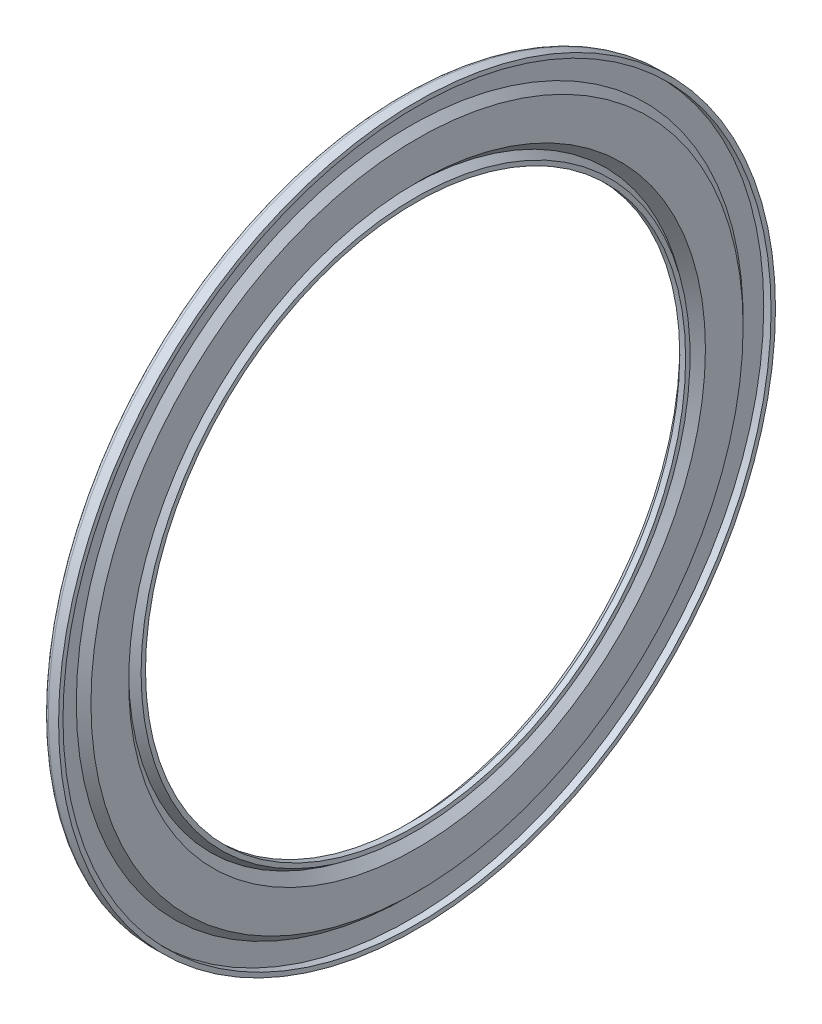
ISO-10303-21;
HEADER;
FILE_DESCRIPTION(('STEP AP214'),'2;1');
FILE_NAME('part.step','',(''),(''),'','','');
FILE_SCHEMA(('AUTOMOTIVE_DESIGN { 1 0 10303 214 1 1 1 1 }'));
ENDSEC;
DATA;
#1=APPLICATION_CONTEXT('core data for automotive mechanical design processes');
#2=APPLICATION_PROTOCOL_DEFINITION('international standard','automotive_design',2000,#1);
#3=PRODUCT_CONTEXT('',#1,'mechanical');
#4=PRODUCT('Part','Part','',(#3));
#5=PRODUCT_RELATED_PRODUCT_CATEGORY('part','',(#4));
#6=PRODUCT_DEFINITION_FORMATION('','',#4);
#7=PRODUCT_DEFINITION_CONTEXT('part definition',#1,'design');
#8=PRODUCT_DEFINITION('design','',#6,#7);
#9=PRODUCT_DEFINITION_SHAPE('','',#8);
#10=(LENGTH_UNIT() NAMED_UNIT(*) SI_UNIT(.MILLI.,.METRE.));
#11=(NAMED_UNIT(*) PLANE_ANGLE_UNIT() SI_UNIT($,.RADIAN.));
#12=(NAMED_UNIT(*) SI_UNIT($,.STERADIAN.) SOLID_ANGLE_UNIT());
#13=UNCERTAINTY_MEASURE_WITH_UNIT(LENGTH_MEASURE(1.E-05),#10,'distance_accuracy_value','');
#14=(GEOMETRIC_REPRESENTATION_CONTEXT(3) GLOBAL_UNCERTAINTY_ASSIGNED_CONTEXT((#13)) GLOBAL_UNIT_ASSIGNED_CONTEXT((#10,
#11,#12)) REPRESENTATION_CONTEXT('',''));
#15=CARTESIAN_POINT('',(0.,0.,0.));
#16=DIRECTION('',(0.,0.,1.));
#17=DIRECTION('',(1.,0.,0.));
#18=AXIS2_PLACEMENT_3D('',#15,#16,#17);
#19=CARTESIAN_POINT('',(9.7525,0.,35.703125));
#20=DIRECTION('',(-1.,0.,0.));
#21=DIRECTION('',(0.,0.,1.));
#22=AXIS2_PLACEMENT_3D('',#19,#20,#21);
#23=PLANE('',#22);
#24=CARTESIAN_POINT('',(9.75249999999999,0.,0.));
#25=DIRECTION('',(1.,0.,0.));
#26=DIRECTION('',(0.,0.,-1.));
#27=AXIS2_PLACEMENT_3D('',#24,#25,#26);
#28=CIRCLE('',#27,33.63925);
#29=CARTESIAN_POINT('',(9.75249999999999,0.,-33.63925));
#30=VERTEX_POINT('',#29);
#31=EDGE_CURVE('E63',#30,#30,#28,.F.);
#32=ORIENTED_EDGE('',*,*,#31,.F.);
#33=EDGE_LOOP('',(#32));
#34=FACE_BOUND('',#33,.T.);
#35=CARTESIAN_POINT('',(9.7525,0.,0.));
#36=DIRECTION('',(-1.,0.,0.));
#37=DIRECTION('',(0.,0.,1.));
#38=AXIS2_PLACEMENT_3D('',#35,#36,#37);
#39=CIRCLE('',#38,37.767);
#40=CARTESIAN_POINT('',(9.7525,0.,37.767));
#41=VERTEX_POINT('',#40);
#42=EDGE_CURVE('E17',#41,#41,#39,.F.);
#43=ORIENTED_EDGE('',*,*,#42,.F.);
#44=EDGE_LOOP('',(#43));
#45=FACE_BOUND('',#44,.T.);
#46=ADVANCED_FACE('F14',(#34,#45),#23,.T.);
#47=CARTESIAN_POINT('',(9.75249999999999,0.,0.));
#48=DIRECTION('',(-1.,0.,0.));
#49=DIRECTION('',(0.,0.,1.));
#50=AXIS2_PLACEMENT_3D('',#47,#48,#49);
#51=CONICAL_SURFACE('',#50,37.767,0.785398163397447);
#52=CARTESIAN_POINT('',(8.90000000000001,0.,0.));
#53=DIRECTION('',(-1.,0.,0.));
#54=DIRECTION('',(0.,0.,1.));
#55=AXIS2_PLACEMENT_3D('',#52,#53,#54);
#56=CIRCLE('',#55,38.6195);
#57=CARTESIAN_POINT('',(8.90000000000001,0.,38.6195));
#58=VERTEX_POINT('',#57);
#59=EDGE_CURVE('E61',#58,#58,#56,.F.);
#60=ORIENTED_EDGE('',*,*,#59,.F.);
#61=EDGE_LOOP('',(#60));
#62=FACE_BOUND('',#61,.T.);
#63=ORIENTED_EDGE('',*,*,#42,.T.);
#64=EDGE_LOOP('',(#63));
#65=FACE_BOUND('',#64,.T.);
#66=ADVANCED_FACE('F70',(#62,#65),#51,.F.);
#67=CARTESIAN_POINT('',(9.75249999999999,0.,0.));
#68=DIRECTION('',(1.,0.,0.));
#69=DIRECTION('',(0.,0.,-1.));
#70=AXIS2_PLACEMENT_3D('',#67,#68,#69);
#71=CONICAL_SURFACE('',#70,33.63925,0.785398163397448);
#72=ORIENTED_EDGE('',*,*,#31,.T.);
#73=EDGE_LOOP('',(#72));
#74=FACE_BOUND('',#73,.T.);
#75=CARTESIAN_POINT('',(8.9,0.,0.));
#76=DIRECTION('',(1.,0.,0.));
#77=DIRECTION('',(0.,0.,-1.));
#78=AXIS2_PLACEMENT_3D('',#75,#76,#77);
#79=CIRCLE('',#78,32.78675);
#80=CARTESIAN_POINT('',(8.9,0.,-32.78675));
#81=VERTEX_POINT('',#80);
#82=EDGE_CURVE('E58',#81,#81,#79,.F.);
#83=ORIENTED_EDGE('',*,*,#82,.F.);
#84=EDGE_LOOP('',(#83));
#85=FACE_BOUND('',#84,.T.);
#86=ADVANCED_FACE('F78',(#74,#85),#71,.T.);
#87=CARTESIAN_POINT('',(8.9,0.,39.905125));
#88=DIRECTION('',(-1.,0.,0.));
#89=DIRECTION('',(0.,0.,1.));
#90=AXIS2_PLACEMENT_3D('',#87,#88,#89);
#91=PLANE('',#90);
#92=ORIENTED_EDGE('',*,*,#59,.T.);
#93=EDGE_LOOP('',(#92));
#94=FACE_BOUND('',#93,.T.);
#95=CARTESIAN_POINT('',(8.9,0.,0.));
#96=DIRECTION('',(1.,0.,0.));
#97=DIRECTION('',(0.,0.,1.));
#98=AXIS2_PLACEMENT_3D('',#95,#96,#97);
#99=CIRCLE('',#98,41.19075);
#100=CARTESIAN_POINT('',(8.9,0.,41.19075));
#101=VERTEX_POINT('',#100);
#102=EDGE_CURVE('E57',#101,#101,#99,.T.);
#103=ORIENTED_EDGE('',*,*,#102,.F.);
#104=EDGE_LOOP('',(#103));
#105=FACE_BOUND('',#104,.T.);
#106=ADVANCED_FACE('F146',(#94,#105),#91,.T.);
#107=CARTESIAN_POINT('',(8.9,0.,32.529625));
#108=DIRECTION('',(-1.,0.,0.));
#109=DIRECTION('',(0.,0.,1.));
#110=AXIS2_PLACEMENT_3D('',#107,#108,#109);
#111=PLANE('',#110);
#112=CARTESIAN_POINT('',(8.9,0.,0.));
#113=DIRECTION('',(-1.,0.,0.));
#114=DIRECTION('',(0.,0.,1.));
#115=AXIS2_PLACEMENT_3D('',#112,#113,#114);
#116=CIRCLE('',#115,32.2725);
#117=CARTESIAN_POINT('',(8.9,0.,32.2725));
#118=VERTEX_POINT('',#117);
#119=EDGE_CURVE('E53',#118,#118,#116,.T.);
#120=ORIENTED_EDGE('',*,*,#119,.F.);
#121=EDGE_LOOP('',(#120));
#122=FACE_BOUND('',#121,.T.);
#123=ORIENTED_EDGE('',*,*,#82,.T.);
#124=EDGE_LOOP('',(#123));
#125=FACE_BOUND('',#124,.T.);
#126=ADVANCED_FACE('F131',(#122,#125),#111,.T.);
#127=CARTESIAN_POINT('',(9.41425000000001,0.,0.));
#128=DIRECTION('',(1.,0.,0.));
#129=DIRECTION('',(0.,1.,0.));
#130=AXIS2_PLACEMENT_3D('',#127,#128,#129);
#131=TOROIDAL_SURFACE('',#130,41.19075,0.514250000000004);
#132=ORIENTED_EDGE('',*,*,#102,.T.);
#133=EDGE_LOOP('',(#132));
#134=FACE_BOUND('',#133,.T.);
#135=CARTESIAN_POINT('',(9.41425,0.,0.));
#136=DIRECTION('',(1.,0.,0.));
#137=DIRECTION('',(0.,0.,-1.));
#138=AXIS2_PLACEMENT_3D('',#135,#136,#137);
#139=CIRCLE('',#138,41.705);
#140=CARTESIAN_POINT('',(9.41425,0.,-41.705));
#141=VERTEX_POINT('',#140);
#142=EDGE_CURVE('E56',#141,#141,#139,.T.);
#143=ORIENTED_EDGE('',*,*,#142,.F.);
#144=EDGE_LOOP('',(#143));
#145=FACE_BOUND('',#144,.T.);
#146=ADVANCED_FACE('F125',(#134,#145),#131,.T.);
#147=CARTESIAN_POINT('',(9.7525,0.,0.));
#148=DIRECTION('',(-1.,0.,0.));
#149=DIRECTION('',(0.,0.,1.));
#150=AXIS2_PLACEMENT_3D('',#147,#148,#149);
#151=CONICAL_SURFACE('',#150,31.42,0.785398163397446);
#152=ORIENTED_EDGE('',*,*,#119,.T.);
#153=EDGE_LOOP('',(#152));
#154=FACE_BOUND('',#153,.T.);
#155=CARTESIAN_POINT('',(9.7525,0.,0.));
#156=DIRECTION('',(-1.,0.,0.));
#157=DIRECTION('',(0.,0.,1.));
#158=AXIS2_PLACEMENT_3D('',#155,#156,#157);
#159=CIRCLE('',#158,31.42);
#160=CARTESIAN_POINT('',(9.7525,0.,31.42));
#161=VERTEX_POINT('',#160);
#162=EDGE_CURVE('E52',#161,#161,#159,.T.);
#163=ORIENTED_EDGE('',*,*,#162,.F.);
#164=EDGE_LOOP('',(#163));
#165=FACE_BOUND('',#164,.T.);
#166=ADVANCED_FACE('F122',(#154,#165),#151,.F.);
#167=CARTESIAN_POINT('',(10.009625,0.,0.));
#168=DIRECTION('',(1.,0.,0.));
#169=DIRECTION('',(0.,0.,-1.));
#170=AXIS2_PLACEMENT_3D('',#167,#168,#169);
#171=CYLINDRICAL_SURFACE('',#170,41.705);
#172=CARTESIAN_POINT('',(10.605,0.,0.));
#173=DIRECTION('',(1.,0.,0.));
#174=DIRECTION('',(0.,0.,-1.));
#175=AXIS2_PLACEMENT_3D('',#172,#173,#174);
#176=CIRCLE('',#175,41.705);
#177=CARTESIAN_POINT('',(10.605,0.,-41.705));
#178=VERTEX_POINT('',#177);
#179=EDGE_CURVE('E49',#178,#178,#176,.T.);
#180=ORIENTED_EDGE('',*,*,#179,.F.);
#181=EDGE_LOOP('',(#180));
#182=FACE_BOUND('',#181,.T.);
#183=ORIENTED_EDGE('',*,*,#142,.T.);
#184=EDGE_LOOP('',(#183));
#185=FACE_BOUND('',#184,.T.);
#186=ADVANCED_FACE('F118',(#182,#185),#171,.T.);
#187=CARTESIAN_POINT('',(9.7525,0.,0.));
#188=DIRECTION('',(1.,0.,0.));
#189=DIRECTION('',(0.,0.,-1.));
#190=AXIS2_PLACEMENT_3D('',#187,#188,#189);
#191=CYLINDRICAL_SURFACE('',#190,31.42);
#192=ORIENTED_EDGE('',*,*,#162,.T.);
#193=EDGE_LOOP('',(#192));
#194=FACE_BOUND('',#193,.T.);
#195=CARTESIAN_POINT('',(10.4345,0.,0.));
#196=DIRECTION('',(1.,0.,0.));
#197=DIRECTION('',(0.,0.,-1.));
#198=AXIS2_PLACEMENT_3D('',#195,#196,#197);
#199=CIRCLE('',#198,31.42);
#200=CARTESIAN_POINT('',(10.4345,0.,-31.42));
#201=VERTEX_POINT('',#200);
#202=EDGE_CURVE('E46',#201,#201,#199,.F.);
#203=ORIENTED_EDGE('',*,*,#202,.F.);
#204=EDGE_LOOP('',(#203));
#205=FACE_BOUND('',#204,.T.);
#206=ADVANCED_FACE('F114',(#194,#205),#191,.F.);
#207=CARTESIAN_POINT('',(10.605,0.,41.447875));
#208=DIRECTION('',(1.,0.,0.));
#209=DIRECTION('',(0.,1.,0.));
#210=AXIS2_PLACEMENT_3D('',#207,#208,#209);
#211=PLANE('',#210);
#212=ORIENTED_EDGE('',*,*,#179,.T.);
#213=EDGE_LOOP('',(#212));
#214=FACE_BOUND('',#213,.T.);
#215=CARTESIAN_POINT('',(10.605,0.,0.));
#216=DIRECTION('',(1.,0.,0.));
#217=DIRECTION('',(0.,0.,-1.));
#218=AXIS2_PLACEMENT_3D('',#215,#216,#217);
#219=CIRCLE('',#218,41.19075);
#220=CARTESIAN_POINT('',(10.605,0.,-41.19075));
#221=VERTEX_POINT('',#220);
#222=EDGE_CURVE('E43',#221,#221,#219,.T.);
#223=ORIENTED_EDGE('',*,*,#222,.F.);
#224=EDGE_LOOP('',(#223));
#225=FACE_BOUND('',#224,.T.);
#226=ADVANCED_FACE('F110',(#214,#225),#211,.T.);
#227=CARTESIAN_POINT('',(10.4345,0.,31.677125));
#228=DIRECTION('',(1.,0.,0.));
#229=DIRECTION('',(0.,0.,-1.));
#230=AXIS2_PLACEMENT_3D('',#227,#228,#229);
#231=PLANE('',#230);
#232=CARTESIAN_POINT('',(10.4345,0.,0.));
#233=DIRECTION('',(-1.,0.,0.));
#234=DIRECTION('',(0.,0.,1.));
#235=AXIS2_PLACEMENT_3D('',#232,#233,#234);
#236=CIRCLE('',#235,31.93425);
#237=CARTESIAN_POINT('',(10.4345,0.,31.93425));
#238=VERTEX_POINT('',#237);
#239=EDGE_CURVE('E40',#238,#238,#236,.T.);
#240=ORIENTED_EDGE('',*,*,#239,.F.);
#241=EDGE_LOOP('',(#240));
#242=FACE_BOUND('',#241,.T.);
#243=ORIENTED_EDGE('',*,*,#202,.T.);
#244=EDGE_LOOP('',(#243));
#245=FACE_BOUND('',#244,.T.);
#246=ADVANCED_FACE('F106',(#242,#245),#231,.T.);
#247=CARTESIAN_POINT('',(9.7525,0.,0.));
#248=DIRECTION('',(1.,0.,0.));
#249=DIRECTION('',(0.,0.,-1.));
#250=AXIS2_PLACEMENT_3D('',#247,#248,#249);
#251=CYLINDRICAL_SURFACE('',#250,41.19075);
#252=CARTESIAN_POINT('',(9.7525,0.,0.));
#253=DIRECTION('',(1.,0.,0.));
#254=DIRECTION('',(0.,0.,-1.));
#255=AXIS2_PLACEMENT_3D('',#252,#253,#254);
#256=CIRCLE('',#255,41.19075);
#257=CARTESIAN_POINT('',(9.7525,0.,-41.19075));
#258=VERTEX_POINT('',#257);
#259=EDGE_CURVE('E37',#258,#258,#256,.T.);
#260=ORIENTED_EDGE('',*,*,#259,.F.);
#261=EDGE_LOOP('',(#260));
#262=FACE_BOUND('',#261,.T.);
#263=ORIENTED_EDGE('',*,*,#222,.T.);
#264=EDGE_LOOP('',(#263));
#265=FACE_BOUND('',#264,.T.);
#266=ADVANCED_FACE('F102',(#262,#265),#251,.F.);
#267=CARTESIAN_POINT('',(9.582,0.,0.));
#268=DIRECTION('',(-1.,0.,0.));
#269=DIRECTION('',(0.,0.,1.));
#270=AXIS2_PLACEMENT_3D('',#267,#268,#269);
#271=CONICAL_SURFACE('',#270,32.529625,0.609642658562305);
#272=ORIENTED_EDGE('',*,*,#239,.T.);
#273=EDGE_LOOP('',(#272));
#274=FACE_BOUND('',#273,.T.);
#275=CARTESIAN_POINT('',(9.582,0.,0.));
#276=DIRECTION('',(1.,0.,0.));
#277=DIRECTION('',(0.,0.,1.));
#278=AXIS2_PLACEMENT_3D('',#275,#276,#277);
#279=CIRCLE('',#278,32.529625);
#280=CARTESIAN_POINT('',(9.582,0.,32.529625));
#281=VERTEX_POINT('',#280);
#282=EDGE_CURVE('E36',#281,#281,#279,.F.);
#283=ORIENTED_EDGE('',*,*,#282,.F.);
#284=EDGE_LOOP('',(#283));
#285=FACE_BOUND('',#284,.T.);
#286=ADVANCED_FACE('F98',(#274,#285),#271,.T.);
#287=CARTESIAN_POINT('',(9.7525,0.,39.990375));
#288=DIRECTION('',(1.,0.,0.));
#289=DIRECTION('',(0.,0.,-1.));
#290=AXIS2_PLACEMENT_3D('',#287,#288,#289);
#291=PLANE('',#290);
#292=ORIENTED_EDGE('',*,*,#259,.T.);
#293=EDGE_LOOP('',(#292));
#294=FACE_BOUND('',#293,.T.);
#295=CARTESIAN_POINT('',(9.75249999999999,0.,0.));
#296=DIRECTION('',(-1.,0.,0.));
#297=DIRECTION('',(0.,0.,1.));
#298=AXIS2_PLACEMENT_3D('',#295,#296,#297);
#299=CIRCLE('',#298,38.79);
#300=CARTESIAN_POINT('',(9.75249999999999,0.,38.79));
#301=VERTEX_POINT('',#300);
#302=EDGE_CURVE('E26',#301,#301,#299,.F.);
#303=ORIENTED_EDGE('',*,*,#302,.F.);
#304=EDGE_LOOP('',(#303));
#305=FACE_BOUND('',#304,.T.);
#306=ADVANCED_FACE('F94',(#294,#305),#291,.T.);
#307=CARTESIAN_POINT('',(9.582,0.,0.));
#308=DIRECTION('',(1.,0.,0.));
#309=DIRECTION('',(0.,0.,-1.));
#310=AXIS2_PLACEMENT_3D('',#307,#308,#309);
#311=CONICAL_SURFACE('',#310,32.529625,0.785398163397448);
#312=ORIENTED_EDGE('',*,*,#282,.T.);
#313=EDGE_LOOP('',(#312));
#314=FACE_BOUND('',#313,.T.);
#315=CARTESIAN_POINT('',(10.605,0.,0.));
#316=DIRECTION('',(1.,0.,0.));
#317=DIRECTION('',(0.,0.,-1.));
#318=AXIS2_PLACEMENT_3D('',#315,#316,#317);
#319=CIRCLE('',#318,33.552625);
#320=CARTESIAN_POINT('',(10.605,0.,-33.552625));
#321=VERTEX_POINT('',#320);
#322=EDGE_CURVE('E21',#321,#321,#319,.F.);
#323=ORIENTED_EDGE('',*,*,#322,.F.);
#324=EDGE_LOOP('',(#323));
#325=FACE_BOUND('',#324,.T.);
#326=ADVANCED_FACE('F87',(#314,#325),#311,.F.);
#327=CARTESIAN_POINT('',(9.75249999999999,0.,0.));
#328=DIRECTION('',(-1.,0.,0.));
#329=DIRECTION('',(0.,0.,1.));
#330=AXIS2_PLACEMENT_3D('',#327,#328,#329);
#331=CONICAL_SURFACE('',#330,38.79,0.785398163397447);
#332=CARTESIAN_POINT('',(10.605,0.,0.));
#333=DIRECTION('',(-1.,0.,0.));
#334=DIRECTION('',(0.,0.,1.));
#335=AXIS2_PLACEMENT_3D('',#332,#333,#334);
#336=CIRCLE('',#335,37.9375);
#337=CARTESIAN_POINT('',(10.605,0.,37.9375));
#338=VERTEX_POINT('',#337);
#339=EDGE_CURVE('E10',#338,#338,#336,.F.);
#340=ORIENTED_EDGE('',*,*,#339,.F.);
#341=EDGE_LOOP('',(#340));
#342=FACE_BOUND('',#341,.T.);
#343=ORIENTED_EDGE('',*,*,#302,.T.);
#344=EDGE_LOOP('',(#343));
#345=FACE_BOUND('',#344,.T.);
#346=ADVANCED_FACE('F82',(#342,#345),#331,.T.);
#347=CARTESIAN_POINT('',(10.605,0.,35.7450625));
#348=DIRECTION('',(1.,0.,0.));
#349=DIRECTION('',(0.,0.,-1.));
#350=AXIS2_PLACEMENT_3D('',#347,#348,#349);
#351=PLANE('',#350);
#352=ORIENTED_EDGE('',*,*,#339,.T.);
#353=EDGE_LOOP('',(#352));
#354=FACE_BOUND('',#353,.T.);
#355=ORIENTED_EDGE('',*,*,#322,.T.);
#356=EDGE_LOOP('',(#355));
#357=FACE_BOUND('',#356,.T.);
#358=ADVANCED_FACE('F80',(#354,#357),#351,.T.);
#359=CLOSED_SHELL('',(#46,#66,#86,#106,#126,#146,#166,#186,#206,#226,#246,#266,#286,#306,#326,
#346,#358));
#360=MANIFOLD_SOLID_BREP('B1',#359);
#361=ADVANCED_BREP_SHAPE_REPRESENTATION('',(#18,#360),#14);
#362=SHAPE_DEFINITION_REPRESENTATION(#9,#361);
ENDSEC;
END-ISO-10303-21;
